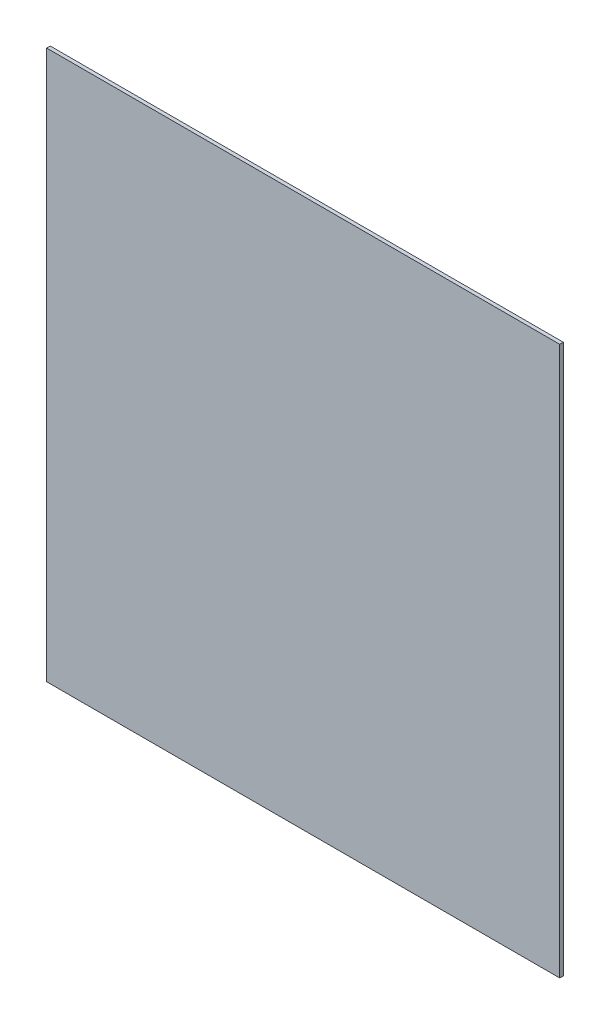
ISO-10303-21;
HEADER;
FILE_DESCRIPTION(('STEP AP214'),'2;1');
FILE_NAME('part.step','',(''),(''),'','','');
FILE_SCHEMA(('AUTOMOTIVE_DESIGN { 1 0 10303 214 1 1 1 1 }'));
ENDSEC;
DATA;
#1=APPLICATION_CONTEXT('core data for automotive mechanical design processes');
#2=APPLICATION_PROTOCOL_DEFINITION('international standard','automotive_design',2000,#1);
#3=PRODUCT_CONTEXT('',#1,'mechanical');
#4=PRODUCT('Part','Part','',(#3));
#5=PRODUCT_RELATED_PRODUCT_CATEGORY('part','',(#4));
#6=PRODUCT_DEFINITION_FORMATION('','',#4);
#7=PRODUCT_DEFINITION_CONTEXT('part definition',#1,'design');
#8=PRODUCT_DEFINITION('design','',#6,#7);
#9=PRODUCT_DEFINITION_SHAPE('','',#8);
#10=(LENGTH_UNIT() NAMED_UNIT(*) SI_UNIT(.MILLI.,.METRE.));
#11=(NAMED_UNIT(*) PLANE_ANGLE_UNIT() SI_UNIT($,.RADIAN.));
#12=(NAMED_UNIT(*) SI_UNIT($,.STERADIAN.) SOLID_ANGLE_UNIT());
#13=UNCERTAINTY_MEASURE_WITH_UNIT(LENGTH_MEASURE(1.E-05),#10,'distance_accuracy_value','');
#14=(GEOMETRIC_REPRESENTATION_CONTEXT(3) GLOBAL_UNCERTAINTY_ASSIGNED_CONTEXT((#13)) GLOBAL_UNIT_ASSIGNED_CONTEXT((#10,
#11,#12)) REPRESENTATION_CONTEXT('',''));
#15=CARTESIAN_POINT('',(0.,0.,0.));
#16=DIRECTION('',(0.,0.,1.));
#17=DIRECTION('',(1.,0.,0.));
#18=AXIS2_PLACEMENT_3D('',#15,#16,#17);
#19=CARTESIAN_POINT('',(-215.,230.,3.));
#20=DIRECTION('',(1.,0.,0.));
#21=DIRECTION('',(0.,1.,0.));
#22=AXIS2_PLACEMENT_3D('',#19,#20,#21);
#23=PLANE('',#22);
#24=DIRECTION('',(0.,-1.,0.));
#25=VECTOR('',#24,1.);
#26=CARTESIAN_POINT('',(-215.,230.,0.));
#27=LINE('',#26,#25);
#28=CARTESIAN_POINT('',(-215.,230.,0.));
#29=VERTEX_POINT('',#28);
#30=CARTESIAN_POINT('',(-215.,-230.,0.));
#31=VERTEX_POINT('',#30);
#32=EDGE_CURVE('E96',#29,#31,#27,.T.);
#33=ORIENTED_EDGE('',*,*,#32,.T.);
#34=DIRECTION('',(0.,0.,-1.));
#35=VECTOR('',#34,1.);
#36=CARTESIAN_POINT('',(-215.,-230.,3.));
#37=LINE('',#36,#35);
#38=CARTESIAN_POINT('',(-215.,-230.,3.));
#39=VERTEX_POINT('',#38);
#40=EDGE_CURVE('E11',#39,#31,#37,.T.);
#41=ORIENTED_EDGE('',*,*,#40,.F.);
#42=DIRECTION('',(0.,-1.,0.));
#43=VECTOR('',#42,1.);
#44=CARTESIAN_POINT('',(-215.,230.,3.));
#45=LINE('',#44,#43);
#46=CARTESIAN_POINT('',(-215.,230.,3.));
#47=VERTEX_POINT('',#46);
#48=EDGE_CURVE('E84',#47,#39,#45,.T.);
#49=ORIENTED_EDGE('',*,*,#48,.F.);
#50=DIRECTION('',(0.,0.,-1.));
#51=VECTOR('',#50,1.);
#52=CARTESIAN_POINT('',(-215.,230.,3.));
#53=LINE('',#52,#51);
#54=EDGE_CURVE('E92',#47,#29,#53,.T.);
#55=ORIENTED_EDGE('',*,*,#54,.T.);
#56=EDGE_LOOP('',(#33,#41,#49,#55));
#57=FACE_BOUND('',#56,.T.);
#58=ADVANCED_FACE('F33',(#57),#23,.F.);
#59=CARTESIAN_POINT('',(-215.,-230.,3.));
#60=DIRECTION('',(0.,1.,0.));
#61=DIRECTION('',(-1.,0.,0.));
#62=AXIS2_PLACEMENT_3D('',#59,#60,#61);
#63=PLANE('',#62);
#64=DIRECTION('',(1.,0.,0.));
#65=VECTOR('',#64,1.);
#66=CARTESIAN_POINT('',(-215.,-230.,0.));
#67=LINE('',#66,#65);
#68=CARTESIAN_POINT('',(215.,-230.,0.));
#69=VERTEX_POINT('',#68);
#70=EDGE_CURVE('E88',#31,#69,#67,.T.);
#71=ORIENTED_EDGE('',*,*,#70,.T.);
#72=DIRECTION('',(0.,0.,-1.));
#73=VECTOR('',#72,1.);
#74=CARTESIAN_POINT('',(215.,-230.,3.));
#75=LINE('',#74,#73);
#76=CARTESIAN_POINT('',(215.,-230.,3.));
#77=VERTEX_POINT('',#76);
#78=EDGE_CURVE('E41',#77,#69,#75,.T.);
#79=ORIENTED_EDGE('',*,*,#78,.F.);
#80=DIRECTION('',(1.,0.,0.));
#81=VECTOR('',#80,1.);
#82=CARTESIAN_POINT('',(-215.,-230.,3.));
#83=LINE('',#82,#81);
#84=EDGE_CURVE('E79',#39,#77,#83,.T.);
#85=ORIENTED_EDGE('',*,*,#84,.F.);
#86=ORIENTED_EDGE('',*,*,#40,.T.);
#87=EDGE_LOOP('',(#71,#79,#85,#86));
#88=FACE_BOUND('',#87,.T.);
#89=ADVANCED_FACE('F87',(#88),#63,.F.);
#90=CARTESIAN_POINT('',(215.,230.,3.));
#91=DIRECTION('',(-1.,0.,0.));
#92=DIRECTION('',(0.,-1.,0.));
#93=AXIS2_PLACEMENT_3D('',#90,#91,#92);
#94=PLANE('',#93);
#95=DIRECTION('',(0.,1.,0.));
#96=VECTOR('',#95,1.);
#97=CARTESIAN_POINT('',(215.,230.,0.));
#98=LINE('',#97,#96);
#99=CARTESIAN_POINT('',(215.,230.,0.));
#100=VERTEX_POINT('',#99);
#101=EDGE_CURVE('E66',#69,#100,#98,.T.);
#102=ORIENTED_EDGE('',*,*,#101,.T.);
#103=DIRECTION('',(0.,0.,-1.));
#104=VECTOR('',#103,1.);
#105=CARTESIAN_POINT('',(215.,230.,3.));
#106=LINE('',#105,#104);
#107=CARTESIAN_POINT('',(215.,230.,3.));
#108=VERTEX_POINT('',#107);
#109=EDGE_CURVE('E89',#108,#100,#106,.T.);
#110=ORIENTED_EDGE('',*,*,#109,.F.);
#111=DIRECTION('',(0.,1.,0.));
#112=VECTOR('',#111,1.);
#113=CARTESIAN_POINT('',(215.,230.,3.));
#114=LINE('',#113,#112);
#115=EDGE_CURVE('E82',#77,#108,#114,.T.);
#116=ORIENTED_EDGE('',*,*,#115,.F.);
#117=ORIENTED_EDGE('',*,*,#78,.T.);
#118=EDGE_LOOP('',(#102,#110,#116,#117));
#119=FACE_BOUND('',#118,.T.);
#120=ADVANCED_FACE('F90',(#119),#94,.F.);
#121=CARTESIAN_POINT('',(-215.,230.,3.));
#122=DIRECTION('',(0.,-1.,0.));
#123=DIRECTION('',(1.,0.,0.));
#124=AXIS2_PLACEMENT_3D('',#121,#122,#123);
#125=PLANE('',#124);
#126=DIRECTION('',(-1.,0.,0.));
#127=VECTOR('',#126,1.);
#128=CARTESIAN_POINT('',(-215.,230.,0.));
#129=LINE('',#128,#127);
#130=EDGE_CURVE('E72',#100,#29,#129,.T.);
#131=ORIENTED_EDGE('',*,*,#130,.T.);
#132=ORIENTED_EDGE('',*,*,#54,.F.);
#133=DIRECTION('',(-1.,0.,0.));
#134=VECTOR('',#133,1.);
#135=CARTESIAN_POINT('',(-215.,230.,3.));
#136=LINE('',#135,#134);
#137=EDGE_CURVE('E49',#108,#47,#136,.T.);
#138=ORIENTED_EDGE('',*,*,#137,.F.);
#139=ORIENTED_EDGE('',*,*,#109,.T.);
#140=EDGE_LOOP('',(#131,#132,#138,#139));
#141=FACE_BOUND('',#140,.T.);
#142=ADVANCED_FACE('F103',(#141),#125,.F.);
#143=CARTESIAN_POINT('',(0.,0.,3.));
#144=DIRECTION('',(0.,0.,1.));
#145=DIRECTION('',(1.,0.,0.));
#146=AXIS2_PLACEMENT_3D('',#143,#144,#145);
#147=PLANE('',#146);
#148=ORIENTED_EDGE('',*,*,#48,.T.);
#149=ORIENTED_EDGE('',*,*,#84,.T.);
#150=ORIENTED_EDGE('',*,*,#115,.T.);
#151=ORIENTED_EDGE('',*,*,#137,.T.);
#152=EDGE_LOOP('',(#148,#149,#150,#151));
#153=FACE_BOUND('',#152,.T.);
#154=ADVANCED_FACE('F80',(#153),#147,.T.);
#155=CARTESIAN_POINT('',(0.,0.,0.));
#156=DIRECTION('',(0.,0.,1.));
#157=DIRECTION('',(1.,0.,0.));
#158=AXIS2_PLACEMENT_3D('',#155,#156,#157);
#159=PLANE('',#158);
#160=ORIENTED_EDGE('',*,*,#32,.F.);
#161=ORIENTED_EDGE('',*,*,#130,.F.);
#162=ORIENTED_EDGE('',*,*,#101,.F.);
#163=ORIENTED_EDGE('',*,*,#70,.F.);
#164=EDGE_LOOP('',(#160,#161,#162,#163));
#165=FACE_BOUND('',#164,.T.);
#166=ADVANCED_FACE('F106',(#165),#159,.F.);
#167=CLOSED_SHELL('',(#58,#89,#120,#142,#154,#166));
#168=MANIFOLD_SOLID_BREP('B2',#167);
#169=ADVANCED_BREP_SHAPE_REPRESENTATION('',(#18,#168),#14);
#170=SHAPE_DEFINITION_REPRESENTATION(#9,#169);
ENDSEC;
END-ISO-10303-21;
